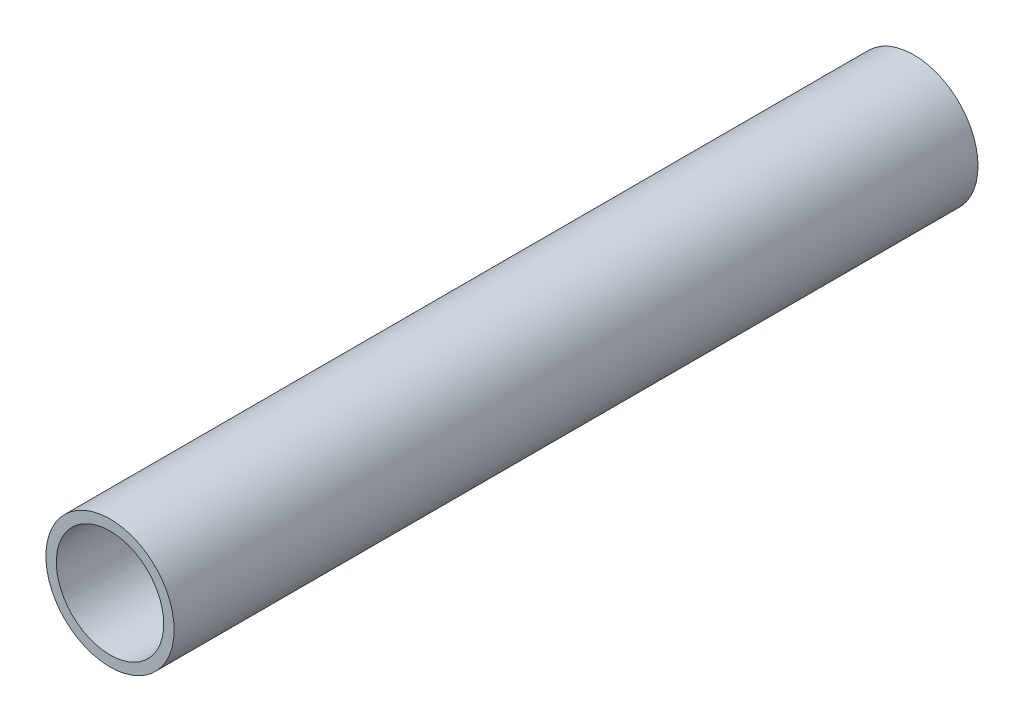
ISO-10303-21;
HEADER;
FILE_DESCRIPTION(('STEP AP214'),'2;1');
FILE_NAME('part.step','',(''),(''),'','','');
FILE_SCHEMA(('AUTOMOTIVE_DESIGN { 1 0 10303 214 1 1 1 1 }'));
ENDSEC;
DATA;
#1=APPLICATION_CONTEXT('core data for automotive mechanical design processes');
#2=APPLICATION_PROTOCOL_DEFINITION('international standard','automotive_design',2000,#1);
#3=PRODUCT_CONTEXT('',#1,'mechanical');
#4=PRODUCT('Part','Part','',(#3));
#5=PRODUCT_RELATED_PRODUCT_CATEGORY('part','',(#4));
#6=PRODUCT_DEFINITION_FORMATION('','',#4);
#7=PRODUCT_DEFINITION_CONTEXT('part definition',#1,'design');
#8=PRODUCT_DEFINITION('design','',#6,#7);
#9=PRODUCT_DEFINITION_SHAPE('','',#8);
#10=(LENGTH_UNIT() NAMED_UNIT(*) SI_UNIT(.MILLI.,.METRE.));
#11=(NAMED_UNIT(*) PLANE_ANGLE_UNIT() SI_UNIT($,.RADIAN.));
#12=(NAMED_UNIT(*) SI_UNIT($,.STERADIAN.) SOLID_ANGLE_UNIT());
#13=UNCERTAINTY_MEASURE_WITH_UNIT(LENGTH_MEASURE(1.E-05),#10,'distance_accuracy_value','');
#14=(GEOMETRIC_REPRESENTATION_CONTEXT(3) GLOBAL_UNCERTAINTY_ASSIGNED_CONTEXT((#13)) GLOBAL_UNIT_ASSIGNED_CONTEXT((#10,
#11,#12)) REPRESENTATION_CONTEXT('',''));
#15=CARTESIAN_POINT('',(0.,0.,0.));
#16=DIRECTION('',(0.,0.,1.));
#17=DIRECTION('',(1.,0.,0.));
#18=AXIS2_PLACEMENT_3D('',#15,#16,#17);
#19=CARTESIAN_POINT('',(0.,0.,69.24));
#20=DIRECTION('',(0.,0.,1.));
#21=DIRECTION('',(1.,0.,0.));
#22=AXIS2_PLACEMENT_3D('',#19,#20,#21);
#23=PLANE('',#22);
#24=CARTESIAN_POINT('',(0.,0.,69.24));
#25=DIRECTION('',(0.,0.,1.));
#26=DIRECTION('',(1.,0.,0.));
#27=AXIS2_PLACEMENT_3D('',#24,#25,#26);
#28=CIRCLE('',#27,5.525);
#29=CARTESIAN_POINT('',(5.525,0.,69.24));
#30=VERTEX_POINT('',#29);
#31=EDGE_CURVE('E10',#30,#30,#28,.T.);
#32=ORIENTED_EDGE('',*,*,#31,.T.);
#33=EDGE_LOOP('',(#32));
#34=FACE_BOUND('',#33,.T.);
#35=CARTESIAN_POINT('',(0.,0.,69.24));
#36=DIRECTION('',(0.,0.,1.));
#37=DIRECTION('',(1.,0.,0.));
#38=AXIS2_PLACEMENT_3D('',#35,#36,#37);
#39=CIRCLE('',#38,4.625);
#40=CARTESIAN_POINT('',(4.625,0.,69.24));
#41=VERTEX_POINT('',#40);
#42=EDGE_CURVE('E42',#41,#41,#39,.T.);
#43=ORIENTED_EDGE('',*,*,#42,.F.);
#44=EDGE_LOOP('',(#43));
#45=FACE_BOUND('',#44,.T.);
#46=ADVANCED_FACE('F31',(#34,#45),#23,.T.);
#47=CARTESIAN_POINT('',(0.,0.,0.));
#48=DIRECTION('',(0.,0.,1.));
#49=DIRECTION('',(1.,0.,0.));
#50=AXIS2_PLACEMENT_3D('',#47,#48,#49);
#51=PLANE('',#50);
#52=CARTESIAN_POINT('',(0.,0.,0.));
#53=DIRECTION('',(0.,0.,1.));
#54=DIRECTION('',(1.,0.,0.));
#55=AXIS2_PLACEMENT_3D('',#52,#53,#54);
#56=CIRCLE('',#55,5.525);
#57=CARTESIAN_POINT('',(5.525,0.,0.));
#58=VERTEX_POINT('',#57);
#59=EDGE_CURVE('E35',#58,#58,#56,.T.);
#60=ORIENTED_EDGE('',*,*,#59,.F.);
#61=EDGE_LOOP('',(#60));
#62=FACE_BOUND('',#61,.T.);
#63=CARTESIAN_POINT('',(0.,0.,0.));
#64=DIRECTION('',(0.,0.,1.));
#65=DIRECTION('',(1.,0.,0.));
#66=AXIS2_PLACEMENT_3D('',#63,#64,#65);
#67=CIRCLE('',#66,4.625);
#68=CARTESIAN_POINT('',(4.625,0.,0.));
#69=VERTEX_POINT('',#68);
#70=EDGE_CURVE('E44',#69,#69,#67,.T.);
#71=ORIENTED_EDGE('',*,*,#70,.T.);
#72=EDGE_LOOP('',(#71));
#73=FACE_BOUND('',#72,.T.);
#74=ADVANCED_FACE('F54',(#62,#73),#51,.F.);
#75=CARTESIAN_POINT('',(0.,0.,69.24));
#76=DIRECTION('',(0.,0.,-1.));
#77=DIRECTION('',(-1.,0.,0.));
#78=AXIS2_PLACEMENT_3D('',#75,#76,#77);
#79=CYLINDRICAL_SURFACE('',#78,5.525);
#80=ORIENTED_EDGE('',*,*,#31,.F.);
#81=EDGE_LOOP('',(#80));
#82=FACE_BOUND('',#81,.T.);
#83=ORIENTED_EDGE('',*,*,#59,.T.);
#84=EDGE_LOOP('',(#83));
#85=FACE_BOUND('',#84,.T.);
#86=ADVANCED_FACE('F33',(#82,#85),#79,.T.);
#87=CARTESIAN_POINT('',(0.,0.,69.24));
#88=DIRECTION('',(0.,0.,-1.));
#89=DIRECTION('',(-1.,0.,0.));
#90=AXIS2_PLACEMENT_3D('',#87,#88,#89);
#91=CYLINDRICAL_SURFACE('',#90,4.625);
#92=ORIENTED_EDGE('',*,*,#42,.T.);
#93=EDGE_LOOP('',(#92));
#94=FACE_BOUND('',#93,.T.);
#95=ORIENTED_EDGE('',*,*,#70,.F.);
#96=EDGE_LOOP('',(#95));
#97=FACE_BOUND('',#96,.T.);
#98=ADVANCED_FACE('F50',(#94,#97),#91,.F.);
#99=CLOSED_SHELL('',(#46,#74,#86,#98));
#100=MANIFOLD_SOLID_BREP('B2',#99);
#101=ADVANCED_BREP_SHAPE_REPRESENTATION('',(#18,#100),#14);
#102=SHAPE_DEFINITION_REPRESENTATION(#9,#101);
ENDSEC;
END-ISO-10303-21;
